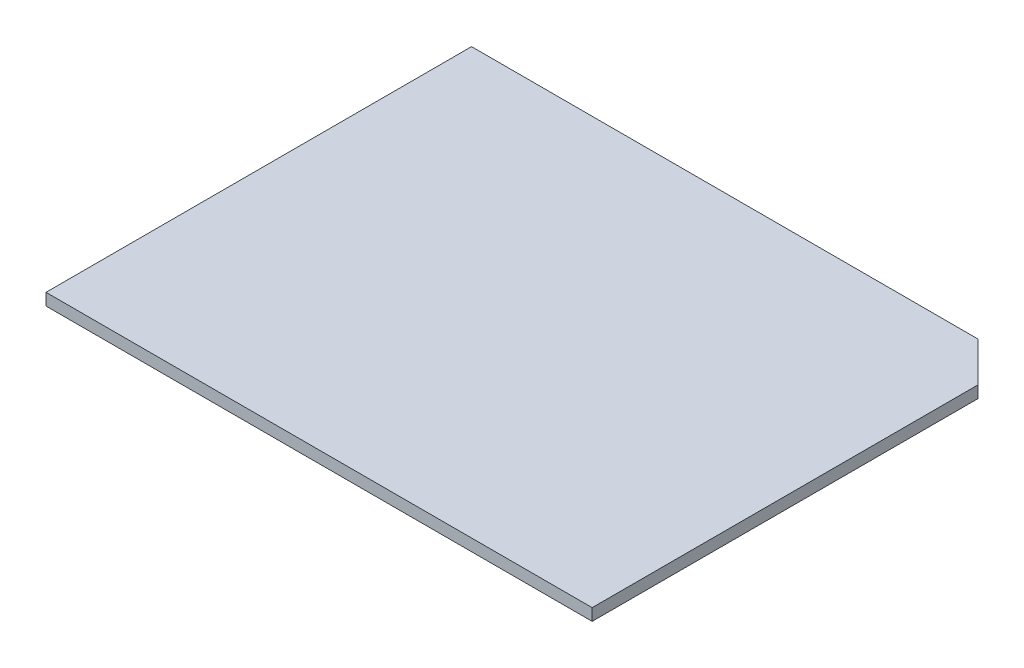
ISO-10303-21;
HEADER;
FILE_DESCRIPTION(('STEP AP214'),'2;1');
FILE_NAME('part.step','',(''),(''),'','','');
FILE_SCHEMA(('AUTOMOTIVE_DESIGN { 1 0 10303 214 1 1 1 1 }'));
ENDSEC;
DATA;
#1=APPLICATION_CONTEXT('core data for automotive mechanical design processes');
#2=APPLICATION_PROTOCOL_DEFINITION('international standard','automotive_design',2000,#1);
#3=PRODUCT_CONTEXT('',#1,'mechanical');
#4=PRODUCT('Part','Part','',(#3));
#5=PRODUCT_RELATED_PRODUCT_CATEGORY('part','',(#4));
#6=PRODUCT_DEFINITION_FORMATION('','',#4);
#7=PRODUCT_DEFINITION_CONTEXT('part definition',#1,'design');
#8=PRODUCT_DEFINITION('design','',#6,#7);
#9=PRODUCT_DEFINITION_SHAPE('','',#8);
#10=(LENGTH_UNIT() NAMED_UNIT(*) SI_UNIT(.MILLI.,.METRE.));
#11=(NAMED_UNIT(*) PLANE_ANGLE_UNIT() SI_UNIT($,.RADIAN.));
#12=(NAMED_UNIT(*) SI_UNIT($,.STERADIAN.) SOLID_ANGLE_UNIT());
#13=UNCERTAINTY_MEASURE_WITH_UNIT(LENGTH_MEASURE(1.E-05),#10,'distance_accuracy_value','');
#14=(GEOMETRIC_REPRESENTATION_CONTEXT(3) GLOBAL_UNCERTAINTY_ASSIGNED_CONTEXT((#13)) GLOBAL_UNIT_ASSIGNED_CONTEXT((#10,
#11,#12)) REPRESENTATION_CONTEXT('',''));
#15=CARTESIAN_POINT('',(0.,0.,0.));
#16=DIRECTION('',(0.,0.,1.));
#17=DIRECTION('',(1.,0.,0.));
#18=AXIS2_PLACEMENT_3D('',#15,#16,#17);
#19=CARTESIAN_POINT('',(5.131098395295,1.5,-9.63201699686495));
#20=DIRECTION('',(0.,0.,1.));
#21=DIRECTION('',(1.,0.,0.));
#22=AXIS2_PLACEMENT_3D('',#19,#20,#21);
#23=PLANE('',#22);
#24=DIRECTION('',(-1.,0.,0.));
#25=VECTOR('',#24,1.);
#26=CARTESIAN_POINT('',(5.131098395295,0.,-9.63201699686495));
#27=LINE('',#26,#25);
#28=CARTESIAN_POINT('',(5.131098395295,0.,-9.63201699686495));
#29=VERTEX_POINT('',#28);
#30=CARTESIAN_POINT('',(-58.648901604705,0.,-9.63201699686494));
#31=VERTEX_POINT('',#30);
#32=EDGE_CURVE('E107',#29,#31,#27,.T.);
#33=ORIENTED_EDGE('',*,*,#32,.T.);
#34=DIRECTION('',(0.,-1.,0.));
#35=VECTOR('',#34,1.);
#36=CARTESIAN_POINT('',(-58.648901604705,1.5,-9.63201699686494));
#37=LINE('',#36,#35);
#38=CARTESIAN_POINT('',(-58.648901604705,1.5,-9.63201699686494));
#39=VERTEX_POINT('',#38);
#40=EDGE_CURVE('E11',#39,#31,#37,.T.);
#41=ORIENTED_EDGE('',*,*,#40,.F.);
#42=DIRECTION('',(-1.,0.,0.));
#43=VECTOR('',#42,1.);
#44=CARTESIAN_POINT('',(5.131098395295,1.5,-9.63201699686495));
#45=LINE('',#44,#43);
#46=CARTESIAN_POINT('',(5.131098395295,1.5,-9.63201699686495));
#47=VERTEX_POINT('',#46);
#48=EDGE_CURVE('E115',#47,#39,#45,.T.);
#49=ORIENTED_EDGE('',*,*,#48,.F.);
#50=DIRECTION('',(0.,-1.,0.));
#51=VECTOR('',#50,1.);
#52=CARTESIAN_POINT('',(5.131098395295,1.5,-9.63201699686495));
#53=LINE('',#52,#51);
#54=EDGE_CURVE('E103',#47,#29,#53,.T.);
#55=ORIENTED_EDGE('',*,*,#54,.T.);
#56=EDGE_LOOP('',(#33,#41,#49,#55));
#57=FACE_BOUND('',#56,.T.);
#58=ADVANCED_FACE('F33',(#57),#23,.F.);
#59=CARTESIAN_POINT('',(-58.648901604705,1.5,-9.63201699686494));
#60=DIRECTION('',(1.,0.,0.));
#61=DIRECTION('',(0.,0.,-1.));
#62=AXIS2_PLACEMENT_3D('',#59,#60,#61);
#63=PLANE('',#62);
#64=DIRECTION('',(0.,0.,1.));
#65=VECTOR('',#64,1.);
#66=CARTESIAN_POINT('',(-58.648901604705,0.,-9.63201699686494));
#67=LINE('',#66,#65);
#68=CARTESIAN_POINT('',(-58.648901604705,0.,43.9579830031351));
#69=VERTEX_POINT('',#68);
#70=EDGE_CURVE('E110',#31,#69,#67,.T.);
#71=ORIENTED_EDGE('',*,*,#70,.T.);
#72=DIRECTION('',(0.,-1.,0.));
#73=VECTOR('',#72,1.);
#74=CARTESIAN_POINT('',(-58.648901604705,1.5,43.9579830031351));
#75=LINE('',#74,#73);
#76=CARTESIAN_POINT('',(-58.648901604705,1.5,43.9579830031351));
#77=VERTEX_POINT('',#76);
#78=EDGE_CURVE('E41',#77,#69,#75,.T.);
#79=ORIENTED_EDGE('',*,*,#78,.F.);
#80=DIRECTION('',(0.,0.,1.));
#81=VECTOR('',#80,1.);
#82=CARTESIAN_POINT('',(-58.648901604705,1.5,-9.63201699686494));
#83=LINE('',#82,#81);
#84=EDGE_CURVE('E83',#39,#77,#83,.T.);
#85=ORIENTED_EDGE('',*,*,#84,.F.);
#86=ORIENTED_EDGE('',*,*,#40,.T.);
#87=EDGE_LOOP('',(#71,#79,#85,#86));
#88=FACE_BOUND('',#87,.T.);
#89=ADVANCED_FACE('F134',(#88),#63,.F.);
#90=CARTESIAN_POINT('',(-58.648901604705,1.5,43.9579830031351));
#91=DIRECTION('',(0.,0.,-1.));
#92=DIRECTION('',(-1.,0.,0.));
#93=AXIS2_PLACEMENT_3D('',#90,#91,#92);
#94=PLANE('',#93);
#95=DIRECTION('',(1.,0.,0.));
#96=VECTOR('',#95,1.);
#97=CARTESIAN_POINT('',(-58.648901604705,0.,43.9579830031351));
#98=LINE('',#97,#96);
#99=CARTESIAN_POINT('',(10.131098395295,0.,43.9579830031351));
#100=VERTEX_POINT('',#99);
#101=EDGE_CURVE('E98',#69,#100,#98,.T.);
#102=ORIENTED_EDGE('',*,*,#101,.T.);
#103=DIRECTION('',(0.,-1.,0.));
#104=VECTOR('',#103,1.);
#105=CARTESIAN_POINT('',(10.131098395295,1.5,43.9579830031351));
#106=LINE('',#105,#104);
#107=CARTESIAN_POINT('',(10.131098395295,1.5,43.9579830031351));
#108=VERTEX_POINT('',#107);
#109=EDGE_CURVE('E95',#108,#100,#106,.T.);
#110=ORIENTED_EDGE('',*,*,#109,.F.);
#111=DIRECTION('',(1.,0.,0.));
#112=VECTOR('',#111,1.);
#113=CARTESIAN_POINT('',(-58.648901604705,1.5,43.9579830031351));
#114=LINE('',#113,#112);
#115=EDGE_CURVE('E87',#77,#108,#114,.T.);
#116=ORIENTED_EDGE('',*,*,#115,.F.);
#117=ORIENTED_EDGE('',*,*,#78,.T.);
#118=EDGE_LOOP('',(#102,#110,#116,#117));
#119=FACE_BOUND('',#118,.T.);
#120=ADVANCED_FACE('F96',(#119),#94,.F.);
#121=CARTESIAN_POINT('',(10.131098395295,1.5,43.9579830031351));
#122=DIRECTION('',(-1.,0.,0.));
#123=DIRECTION('',(0.,0.,1.));
#124=AXIS2_PLACEMENT_3D('',#121,#122,#123);
#125=PLANE('',#124);
#126=DIRECTION('',(0.,0.,-1.));
#127=VECTOR('',#126,1.);
#128=CARTESIAN_POINT('',(10.131098395295,0.,43.9579830031351));
#129=LINE('',#128,#127);
#130=CARTESIAN_POINT('',(10.131098395295,0.,-4.63201699686495));
#131=VERTEX_POINT('',#130);
#132=EDGE_CURVE('E69',#100,#131,#129,.T.);
#133=ORIENTED_EDGE('',*,*,#132,.T.);
#134=DIRECTION('',(0.,-1.,0.));
#135=VECTOR('',#134,1.);
#136=CARTESIAN_POINT('',(10.131098395295,1.5,-4.63201699686495));
#137=LINE('',#136,#135);
#138=CARTESIAN_POINT('',(10.131098395295,1.5,-4.63201699686495));
#139=VERTEX_POINT('',#138);
#140=EDGE_CURVE('E99',#139,#131,#137,.T.);
#141=ORIENTED_EDGE('',*,*,#140,.F.);
#142=DIRECTION('',(0.,0.,-1.));
#143=VECTOR('',#142,1.);
#144=CARTESIAN_POINT('',(10.131098395295,1.5,43.9579830031351));
#145=LINE('',#144,#143);
#146=EDGE_CURVE('E91',#108,#139,#145,.T.);
#147=ORIENTED_EDGE('',*,*,#146,.F.);
#148=ORIENTED_EDGE('',*,*,#109,.T.);
#149=EDGE_LOOP('',(#133,#141,#147,#148));
#150=FACE_BOUND('',#149,.T.);
#151=ADVANCED_FACE('F101',(#150),#125,.F.);
#152=CARTESIAN_POINT('',(10.131098395295,1.5,-4.63201699686495));
#153=DIRECTION('',(-0.707106781186547,0.,0.707106781186547));
#154=DIRECTION('',(0.707106781186548,0.,0.707106781186548));
#155=AXIS2_PLACEMENT_3D('',#152,#153,#154);
#156=PLANE('',#155);
#157=DIRECTION('',(-0.707106781186548,0.,-0.707106781186548));
#158=VECTOR('',#157,1.);
#159=CARTESIAN_POINT('',(10.131098395295,0.,-4.63201699686495));
#160=LINE('',#159,#158);
#161=EDGE_CURVE('E75',#131,#29,#160,.T.);
#162=ORIENTED_EDGE('',*,*,#161,.T.);
#163=ORIENTED_EDGE('',*,*,#54,.F.);
#164=DIRECTION('',(-0.707106781186548,0.,-0.707106781186548));
#165=VECTOR('',#164,1.);
#166=CARTESIAN_POINT('',(10.131098395295,1.5,-4.63201699686495));
#167=LINE('',#166,#165);
#168=EDGE_CURVE('E49',#139,#47,#167,.T.);
#169=ORIENTED_EDGE('',*,*,#168,.F.);
#170=ORIENTED_EDGE('',*,*,#140,.T.);
#171=EDGE_LOOP('',(#162,#163,#169,#170));
#172=FACE_BOUND('',#171,.T.);
#173=ADVANCED_FACE('F123',(#172),#156,.F.);
#174=CARTESIAN_POINT('',(-58.648901604705,1.5,-9.63201699686494));
#175=DIRECTION('',(0.,1.,0.));
#176=DIRECTION('',(0.,0.,1.));
#177=AXIS2_PLACEMENT_3D('',#174,#175,#176);
#178=PLANE('',#177);
#179=ORIENTED_EDGE('',*,*,#48,.T.);
#180=ORIENTED_EDGE('',*,*,#84,.T.);
#181=ORIENTED_EDGE('',*,*,#115,.T.);
#182=ORIENTED_EDGE('',*,*,#146,.T.);
#183=ORIENTED_EDGE('',*,*,#168,.T.);
#184=EDGE_LOOP('',(#179,#180,#181,#182,#183));
#185=FACE_BOUND('',#184,.T.);
#186=ADVANCED_FACE('F89',(#185),#178,.T.);
#187=CARTESIAN_POINT('',(-58.648901604705,0.,-9.63201699686494));
#188=DIRECTION('',(0.,1.,0.));
#189=DIRECTION('',(0.,0.,1.));
#190=AXIS2_PLACEMENT_3D('',#187,#188,#189);
#191=PLANE('',#190);
#192=ORIENTED_EDGE('',*,*,#32,.F.);
#193=ORIENTED_EDGE('',*,*,#161,.F.);
#194=ORIENTED_EDGE('',*,*,#132,.F.);
#195=ORIENTED_EDGE('',*,*,#101,.F.);
#196=ORIENTED_EDGE('',*,*,#70,.F.);
#197=EDGE_LOOP('',(#192,#193,#194,#195,#196));
#198=FACE_BOUND('',#197,.T.);
#199=ADVANCED_FACE('F119',(#198),#191,.F.);
#200=CLOSED_SHELL('',(#58,#89,#120,#151,#173,#186,#199));
#201=MANIFOLD_SOLID_BREP('B2',#200);
#202=ADVANCED_BREP_SHAPE_REPRESENTATION('',(#18,#201),#14);
#203=SHAPE_DEFINITION_REPRESENTATION(#9,#202);
ENDSEC;
END-ISO-10303-21;
